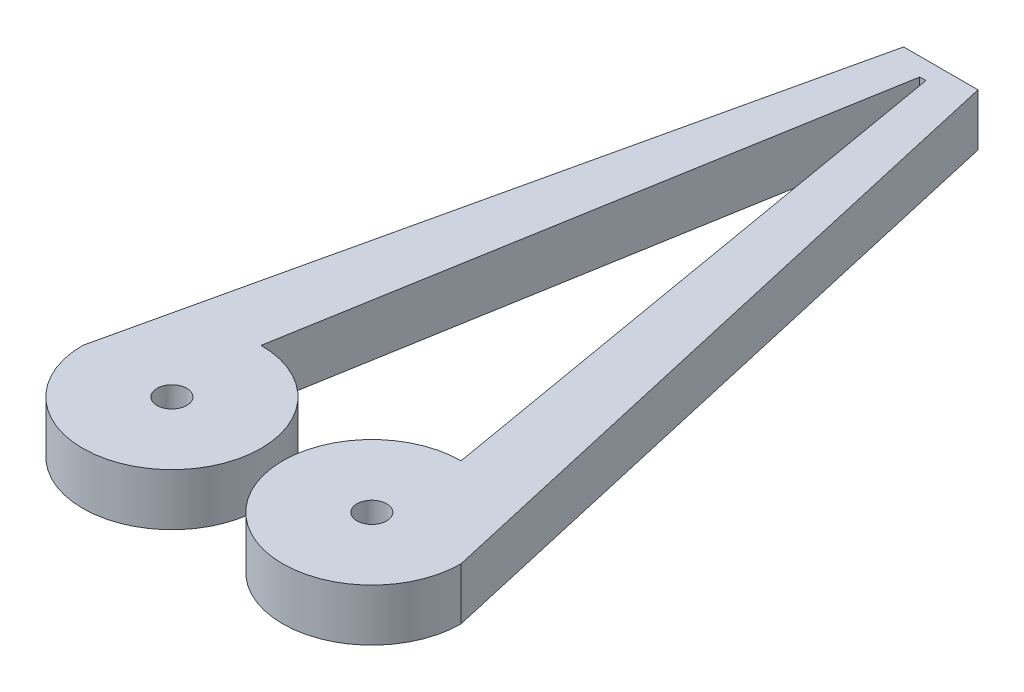
ISO-10303-21;
HEADER;
FILE_DESCRIPTION(('STEP AP214'),'2;1');
FILE_NAME('part.step','',(''),(''),'','','');
FILE_SCHEMA(('AUTOMOTIVE_DESIGN { 1 0 10303 214 1 1 1 1 }'));
ENDSEC;
DATA;
#1=APPLICATION_CONTEXT('core data for automotive mechanical design processes');
#2=APPLICATION_PROTOCOL_DEFINITION('international standard','automotive_design',2000,#1);
#3=PRODUCT_CONTEXT('',#1,'mechanical');
#4=PRODUCT('Part','Part','',(#3));
#5=PRODUCT_RELATED_PRODUCT_CATEGORY('part','',(#4));
#6=PRODUCT_DEFINITION_FORMATION('','',#4);
#7=PRODUCT_DEFINITION_CONTEXT('part definition',#1,'design');
#8=PRODUCT_DEFINITION('design','',#6,#7);
#9=PRODUCT_DEFINITION_SHAPE('','',#8);
#10=(LENGTH_UNIT() NAMED_UNIT(*) SI_UNIT(.MILLI.,.METRE.));
#11=(NAMED_UNIT(*) PLANE_ANGLE_UNIT() SI_UNIT($,.RADIAN.));
#12=(NAMED_UNIT(*) SI_UNIT($,.STERADIAN.) SOLID_ANGLE_UNIT());
#13=UNCERTAINTY_MEASURE_WITH_UNIT(LENGTH_MEASURE(1.E-05),#10,'distance_accuracy_value','');
#14=(GEOMETRIC_REPRESENTATION_CONTEXT(3) GLOBAL_UNCERTAINTY_ASSIGNED_CONTEXT((#13)) GLOBAL_UNIT_ASSIGNED_CONTEXT((#10,
#11,#12)) REPRESENTATION_CONTEXT('',''));
#15=CARTESIAN_POINT('',(0.,0.,0.));
#16=DIRECTION('',(0.,0.,1.));
#17=DIRECTION('',(1.,0.,0.));
#18=AXIS2_PLACEMENT_3D('',#15,#16,#17);
#19=CARTESIAN_POINT('',(26.9,7.,0.));
#20=DIRECTION('',(0.,-1.,0.));
#21=DIRECTION('',(0.,0.,-1.));
#22=AXIS2_PLACEMENT_3D('',#19,#20,#21);
#23=CYLINDRICAL_SURFACE('',#22,12.);
#24=CARTESIAN_POINT('',(26.9,0.,0.));
#25=DIRECTION('',(0.,1.,0.));
#26=DIRECTION('',(0.,0.,1.));
#27=AXIS2_PLACEMENT_3D('',#24,#25,#26);
#28=CIRCLE('',#27,12.);
#29=CARTESIAN_POINT('',(26.9,0.,-12.));
#30=VERTEX_POINT('',#29);
#31=CARTESIAN_POINT('',(38.9,0.,0.));
#32=VERTEX_POINT('',#31);
#33=EDGE_CURVE('E156',#30,#32,#28,.T.);
#34=ORIENTED_EDGE('',*,*,#33,.T.);
#35=DIRECTION('',(0.,-1.,0.));
#36=VECTOR('',#35,1.);
#37=CARTESIAN_POINT('',(38.9,7.,0.));
#38=LINE('',#37,#36);
#39=CARTESIAN_POINT('',(38.9,7.,0.));
#40=VERTEX_POINT('',#39);
#41=EDGE_CURVE('E11',#40,#32,#38,.T.);
#42=ORIENTED_EDGE('',*,*,#41,.F.);
#43=CARTESIAN_POINT('',(26.9,7.,0.));
#44=DIRECTION('',(0.,1.,0.));
#45=DIRECTION('',(0.,0.,1.));
#46=AXIS2_PLACEMENT_3D('',#43,#44,#45);
#47=CIRCLE('',#46,12.);
#48=CARTESIAN_POINT('',(26.9,7.,-12.));
#49=VERTEX_POINT('',#48);
#50=EDGE_CURVE('E100',#49,#40,#47,.T.);
#51=ORIENTED_EDGE('',*,*,#50,.F.);
#52=DIRECTION('',(0.,-1.,0.));
#53=VECTOR('',#52,1.);
#54=CARTESIAN_POINT('',(26.9,7.,-12.));
#55=LINE('',#54,#53);
#56=EDGE_CURVE('E147',#49,#30,#55,.T.);
#57=ORIENTED_EDGE('',*,*,#56,.T.);
#58=EDGE_LOOP('',(#34,#42,#51,#57));
#59=FACE_BOUND('',#58,.T.);
#60=ADVANCED_FACE('F43',(#59),#23,.T.);
#61=CARTESIAN_POINT('',(36.9901983429016,7.,-8.40499506791486));
#62=DIRECTION('',(0.975143498014438,0.,-0.221574272604392));
#63=DIRECTION('',(-0.221574272604392,0.,-0.975143498014438));
#64=AXIS2_PLACEMENT_3D('',#61,#62,#63);
#65=PLANE('',#64);
#66=DIRECTION('',(0.221574272604392,0.,0.975143498014438));
#67=VECTOR('',#66,1.);
#68=CARTESIAN_POINT('',(36.9901983429016,0.,-8.40499506791486));
#69=LINE('',#68,#67);
#70=CARTESIAN_POINT('',(18.45,0.,-90.));
#71=VERTEX_POINT('',#70);
#72=EDGE_CURVE('E160',#71,#32,#69,.T.);
#73=ORIENTED_EDGE('',*,*,#72,.F.);
#74=DIRECTION('',(0.,-1.,0.));
#75=VECTOR('',#74,1.);
#76=CARTESIAN_POINT('',(18.45,7.,-90.));
#77=LINE('',#76,#75);
#78=CARTESIAN_POINT('',(18.45,7.,-90.));
#79=VERTEX_POINT('',#78);
#80=EDGE_CURVE('E53',#79,#71,#77,.T.);
#81=ORIENTED_EDGE('',*,*,#80,.F.);
#82=DIRECTION('',(0.221574272604392,0.,0.975143498014438));
#83=VECTOR('',#82,1.);
#84=CARTESIAN_POINT('',(36.9901983429016,7.,-8.40499506791486));
#85=LINE('',#84,#83);
#86=EDGE_CURVE('E349',#79,#40,#85,.T.);
#87=ORIENTED_EDGE('',*,*,#86,.T.);
#88=ORIENTED_EDGE('',*,*,#41,.T.);
#89=EDGE_LOOP('',(#73,#81,#87,#88));
#90=FACE_BOUND('',#89,.T.);
#91=ADVANCED_FACE('F205',(#90),#65,.T.);
#92=CARTESIAN_POINT('',(0.,7.,-90.));
#93=DIRECTION('',(0.,0.,-1.));
#94=DIRECTION('',(-1.,0.,0.));
#95=AXIS2_PLACEMENT_3D('',#92,#93,#94);
#96=PLANE('',#95);
#97=DIRECTION('',(1.,0.,0.));
#98=VECTOR('',#97,1.);
#99=CARTESIAN_POINT('',(0.,0.,-90.));
#100=LINE('',#99,#98);
#101=CARTESIAN_POINT('',(8.45,0.,-90.));
#102=VERTEX_POINT('',#101);
#103=EDGE_CURVE('E164',#102,#71,#100,.T.);
#104=ORIENTED_EDGE('',*,*,#103,.F.);
#105=DIRECTION('',(0.,-1.,0.));
#106=VECTOR('',#105,1.);
#107=CARTESIAN_POINT('',(8.45,7.,-90.));
#108=LINE('',#107,#106);
#109=CARTESIAN_POINT('',(8.45,7.,-90.));
#110=VERTEX_POINT('',#109);
#111=EDGE_CURVE('E192',#110,#102,#108,.T.);
#112=ORIENTED_EDGE('',*,*,#111,.F.);
#113=DIRECTION('',(1.,0.,0.));
#114=VECTOR('',#113,1.);
#115=CARTESIAN_POINT('',(0.,7.,-90.));
#116=LINE('',#115,#114);
#117=EDGE_CURVE('E202',#110,#79,#116,.T.);
#118=ORIENTED_EDGE('',*,*,#117,.T.);
#119=ORIENTED_EDGE('',*,*,#80,.T.);
#120=EDGE_LOOP('',(#104,#112,#118,#119));
#121=FACE_BOUND('',#120,.T.);
#122=ADVANCED_FACE('F200',(#121),#96,.T.);
#123=CARTESIAN_POINT('',(-11.410858100638,7.,-2.59280053508942));
#124=DIRECTION('',(0.975143498014438,0.,0.221574272604392));
#125=DIRECTION('',(0.221574272604392,0.,-0.975143498014438));
#126=AXIS2_PLACEMENT_3D('',#123,#124,#125);
#127=PLANE('',#126);
#128=DIRECTION('',(-0.221574272604392,0.,0.975143498014438));
#129=VECTOR('',#128,1.);
#130=CARTESIAN_POINT('',(-11.410858100638,0.,-2.59280053508942));
#131=LINE('',#130,#129);
#132=CARTESIAN_POINT('',(-12.,0.,0.));
#133=VERTEX_POINT('',#132);
#134=EDGE_CURVE('E168',#102,#133,#131,.T.);
#135=ORIENTED_EDGE('',*,*,#134,.T.);
#136=DIRECTION('',(0.,-1.,0.));
#137=VECTOR('',#136,1.);
#138=CARTESIAN_POINT('',(-12.,7.,0.));
#139=LINE('',#138,#137);
#140=CARTESIAN_POINT('',(-12.,7.,0.));
#141=VERTEX_POINT('',#140);
#142=EDGE_CURVE('E188',#141,#133,#139,.T.);
#143=ORIENTED_EDGE('',*,*,#142,.F.);
#144=DIRECTION('',(-0.221574272604392,0.,0.975143498014438));
#145=VECTOR('',#144,1.);
#146=CARTESIAN_POINT('',(-11.410858100638,7.,-2.59280053508942));
#147=LINE('',#146,#145);
#148=EDGE_CURVE('E141',#110,#141,#147,.T.);
#149=ORIENTED_EDGE('',*,*,#148,.F.);
#150=ORIENTED_EDGE('',*,*,#111,.T.);
#151=EDGE_LOOP('',(#135,#143,#149,#150));
#152=FACE_BOUND('',#151,.T.);
#153=ADVANCED_FACE('F213',(#152),#127,.F.);
#154=CARTESIAN_POINT('',(0.,7.,0.));
#155=DIRECTION('',(0.,-1.,0.));
#156=DIRECTION('',(0.,0.,-1.));
#157=AXIS2_PLACEMENT_3D('',#154,#155,#156);
#158=CYLINDRICAL_SURFACE('',#157,12.);
#159=CARTESIAN_POINT('',(0.,0.,0.));
#160=DIRECTION('',(0.,1.,0.));
#161=DIRECTION('',(0.,0.,1.));
#162=AXIS2_PLACEMENT_3D('',#159,#160,#161);
#163=CIRCLE('',#162,12.);
#164=CARTESIAN_POINT('',(0.,0.,-12.));
#165=VERTEX_POINT('',#164);
#166=EDGE_CURVE('E171',#133,#165,#163,.T.);
#167=ORIENTED_EDGE('',*,*,#166,.T.);
#168=DIRECTION('',(0.,-1.,0.));
#169=VECTOR('',#168,1.);
#170=CARTESIAN_POINT('',(0.,7.,-12.));
#171=LINE('',#170,#169);
#172=CARTESIAN_POINT('',(0.,7.,-12.));
#173=VERTEX_POINT('',#172);
#174=EDGE_CURVE('E125',#173,#165,#171,.T.);
#175=ORIENTED_EDGE('',*,*,#174,.F.);
#176=CARTESIAN_POINT('',(0.,7.,0.));
#177=DIRECTION('',(0.,1.,0.));
#178=DIRECTION('',(0.,0.,1.));
#179=AXIS2_PLACEMENT_3D('',#176,#177,#178);
#180=CIRCLE('',#179,12.);
#181=EDGE_CURVE('E134',#141,#173,#180,.T.);
#182=ORIENTED_EDGE('',*,*,#181,.F.);
#183=ORIENTED_EDGE('',*,*,#142,.T.);
#184=EDGE_LOOP('',(#167,#175,#182,#183));
#185=FACE_BOUND('',#184,.T.);
#186=ADVANCED_FACE('F216',(#185),#158,.T.);
#187=CARTESIAN_POINT('',(-2.00948059447054,7.,-0.346506589687549));
#188=DIRECTION('',(0.985456468272126,0.,0.169928070490514));
#189=DIRECTION('',(0.169928070490514,0.,-0.985456468272126));
#190=AXIS2_PLACEMENT_3D('',#187,#188,#189);
#191=PLANE('',#190);
#192=DIRECTION('',(-0.169928070490514,0.,0.985456468272126));
#193=VECTOR('',#192,1.);
#194=CARTESIAN_POINT('',(-2.00948059447054,0.,-0.346506589687549));
#195=LINE('',#194,#193);
#196=CARTESIAN_POINT('',(13.0326300632695,0.,-87.5795646791836));
#197=VERTEX_POINT('',#196);
#198=EDGE_CURVE('E123',#197,#165,#195,.T.);
#199=ORIENTED_EDGE('',*,*,#198,.F.);
#200=DIRECTION('',(0.,-1.,0.));
#201=VECTOR('',#200,1.);
#202=CARTESIAN_POINT('',(13.0326300632695,7.,-87.5795646791836));
#203=LINE('',#202,#201);
#204=CARTESIAN_POINT('',(13.0326300632695,7.,-87.5795646791836));
#205=VERTEX_POINT('',#204);
#206=EDGE_CURVE('E117',#205,#197,#203,.T.);
#207=ORIENTED_EDGE('',*,*,#206,.F.);
#208=DIRECTION('',(-0.169928070490514,0.,0.985456468272126));
#209=VECTOR('',#208,1.);
#210=CARTESIAN_POINT('',(-2.00948059447054,7.,-0.346506589687549));
#211=LINE('',#210,#209);
#212=EDGE_CURVE('E121',#205,#173,#211,.T.);
#213=ORIENTED_EDGE('',*,*,#212,.T.);
#214=ORIENTED_EDGE('',*,*,#174,.T.);
#215=EDGE_LOOP('',(#199,#207,#213,#214));
#216=FACE_BOUND('',#215,.T.);
#217=ADVANCED_FACE('F119',(#216),#191,.T.);
#218=CARTESIAN_POINT('',(0.,7.,-87.5795646791836));
#219=DIRECTION('',(0.,0.,-1.));
#220=DIRECTION('',(-1.,0.,0.));
#221=AXIS2_PLACEMENT_3D('',#218,#219,#220);
#222=PLANE('',#221);
#223=DIRECTION('',(1.,0.,0.));
#224=VECTOR('',#223,1.);
#225=CARTESIAN_POINT('',(0.,0.,-87.5795646791836));
#226=LINE('',#225,#224);
#227=CARTESIAN_POINT('',(13.8673699367305,0.,-87.5795646791836));
#228=VERTEX_POINT('',#227);
#229=EDGE_CURVE('E88',#197,#228,#226,.T.);
#230=ORIENTED_EDGE('',*,*,#229,.T.);
#231=DIRECTION('',(0.,-1.,0.));
#232=VECTOR('',#231,1.);
#233=CARTESIAN_POINT('',(13.8673699367305,7.,-87.5795646791836));
#234=LINE('',#233,#232);
#235=CARTESIAN_POINT('',(13.8673699367305,7.,-87.5795646791836));
#236=VERTEX_POINT('',#235);
#237=EDGE_CURVE('E126',#236,#228,#234,.T.);
#238=ORIENTED_EDGE('',*,*,#237,.F.);
#239=DIRECTION('',(1.,0.,0.));
#240=VECTOR('',#239,1.);
#241=CARTESIAN_POINT('',(0.,7.,-87.5795646791836));
#242=LINE('',#241,#240);
#243=EDGE_CURVE('E128',#205,#236,#242,.T.);
#244=ORIENTED_EDGE('',*,*,#243,.F.);
#245=ORIENTED_EDGE('',*,*,#206,.T.);
#246=EDGE_LOOP('',(#230,#238,#244,#245));
#247=FACE_BOUND('',#246,.T.);
#248=ADVANCED_FACE('F129',(#247),#222,.F.);
#249=CARTESIAN_POINT('',(26.9,7.,0.));
#250=DIRECTION('',(0.,-1.,0.));
#251=DIRECTION('',(0.,0.,-1.));
#252=AXIS2_PLACEMENT_3D('',#249,#250,#251);
#253=CYLINDRICAL_SURFACE('',#252,2.);
#254=CARTESIAN_POINT('',(26.9,7.,0.));
#255=DIRECTION('',(0.,1.,0.));
#256=DIRECTION('',(0.,0.,1.));
#257=AXIS2_PLACEMENT_3D('',#254,#255,#256);
#258=CIRCLE('',#257,2.);
#259=CARTESIAN_POINT('',(26.9,7.,2.));
#260=VERTEX_POINT('',#259);
#261=EDGE_CURVE('E246',#260,#260,#258,.T.);
#262=ORIENTED_EDGE('',*,*,#261,.T.);
#263=EDGE_LOOP('',(#262));
#264=FACE_BOUND('',#263,.T.);
#265=CARTESIAN_POINT('',(26.9,0.,0.));
#266=DIRECTION('',(0.,1.,0.));
#267=DIRECTION('',(0.,0.,1.));
#268=AXIS2_PLACEMENT_3D('',#265,#266,#267);
#269=CIRCLE('',#268,2.);
#270=CARTESIAN_POINT('',(26.9,0.,2.));
#271=VERTEX_POINT('',#270);
#272=EDGE_CURVE('E152',#271,#271,#269,.T.);
#273=ORIENTED_EDGE('',*,*,#272,.F.);
#274=EDGE_LOOP('',(#273));
#275=FACE_BOUND('',#274,.T.);
#276=ADVANCED_FACE('F227',(#264,#275),#253,.F.);
#277=CARTESIAN_POINT('',(0.,7.,0.));
#278=DIRECTION('',(0.,-1.,0.));
#279=DIRECTION('',(0.,0.,-1.));
#280=AXIS2_PLACEMENT_3D('',#277,#278,#279);
#281=CYLINDRICAL_SURFACE('',#280,2.);
#282=CARTESIAN_POINT('',(0.,7.,0.));
#283=DIRECTION('',(0.,1.,0.));
#284=DIRECTION('',(0.,0.,1.));
#285=AXIS2_PLACEMENT_3D('',#282,#283,#284);
#286=CIRCLE('',#285,2.);
#287=CARTESIAN_POINT('',(0.,7.,2.));
#288=VERTEX_POINT('',#287);
#289=EDGE_CURVE('E181',#288,#288,#286,.T.);
#290=ORIENTED_EDGE('',*,*,#289,.T.);
#291=EDGE_LOOP('',(#290));
#292=FACE_BOUND('',#291,.T.);
#293=CARTESIAN_POINT('',(0.,0.,0.));
#294=DIRECTION('',(0.,1.,0.));
#295=DIRECTION('',(0.,0.,1.));
#296=AXIS2_PLACEMENT_3D('',#293,#294,#295);
#297=CIRCLE('',#296,2.);
#298=CARTESIAN_POINT('',(0.,0.,2.));
#299=VERTEX_POINT('',#298);
#300=EDGE_CURVE('E148',#299,#299,#297,.T.);
#301=ORIENTED_EDGE('',*,*,#300,.F.);
#302=EDGE_LOOP('',(#301));
#303=FACE_BOUND('',#302,.T.);
#304=ADVANCED_FACE('F45',(#292,#303),#281,.F.);
#305=CARTESIAN_POINT('',(28.1327283225876,7.,-4.85109225562569));
#306=DIRECTION('',(0.985456468272126,0.,-0.169928070490514));
#307=DIRECTION('',(-0.169928070490514,0.,-0.985456468272126));
#308=AXIS2_PLACEMENT_3D('',#305,#306,#307);
#309=PLANE('',#308);
#310=DIRECTION('',(0.169928070490514,0.,0.985456468272126));
#311=VECTOR('',#310,1.);
#312=CARTESIAN_POINT('',(28.1327283225876,0.,-4.85109225562569));
#313=LINE('',#312,#311);
#314=EDGE_CURVE('E94',#228,#30,#313,.T.);
#315=ORIENTED_EDGE('',*,*,#314,.T.);
#316=ORIENTED_EDGE('',*,*,#56,.F.);
#317=DIRECTION('',(0.169928070490514,0.,0.985456468272126));
#318=VECTOR('',#317,1.);
#319=CARTESIAN_POINT('',(28.1327283225876,7.,-4.85109225562569));
#320=LINE('',#319,#318);
#321=EDGE_CURVE('E61',#236,#49,#320,.T.);
#322=ORIENTED_EDGE('',*,*,#321,.F.);
#323=ORIENTED_EDGE('',*,*,#237,.T.);
#324=EDGE_LOOP('',(#315,#316,#322,#323));
#325=FACE_BOUND('',#324,.T.);
#326=ADVANCED_FACE('F218',(#325),#309,.F.);
#327=CARTESIAN_POINT('',(0.,7.,0.));
#328=DIRECTION('',(0.,1.,0.));
#329=DIRECTION('',(0.,0.,1.));
#330=AXIS2_PLACEMENT_3D('',#327,#328,#329);
#331=PLANE('',#330);
#332=ORIENTED_EDGE('',*,*,#289,.F.);
#333=EDGE_LOOP('',(#332));
#334=FACE_BOUND('',#333,.T.);
#335=ORIENTED_EDGE('',*,*,#261,.F.);
#336=EDGE_LOOP('',(#335));
#337=FACE_BOUND('',#336,.T.);
#338=ORIENTED_EDGE('',*,*,#50,.T.);
#339=ORIENTED_EDGE('',*,*,#86,.F.);
#340=ORIENTED_EDGE('',*,*,#117,.F.);
#341=ORIENTED_EDGE('',*,*,#148,.T.);
#342=ORIENTED_EDGE('',*,*,#181,.T.);
#343=ORIENTED_EDGE('',*,*,#212,.F.);
#344=ORIENTED_EDGE('',*,*,#243,.T.);
#345=ORIENTED_EDGE('',*,*,#321,.T.);
#346=EDGE_LOOP('',(#338,#339,#340,#341,#342,#343,#344,#345));
#347=FACE_BOUND('',#346,.T.);
#348=ADVANCED_FACE('F132',(#334,#337,#347),#331,.T.);
#349=CARTESIAN_POINT('',(0.,0.,0.));
#350=DIRECTION('',(0.,1.,0.));
#351=DIRECTION('',(0.,0.,1.));
#352=AXIS2_PLACEMENT_3D('',#349,#350,#351);
#353=PLANE('',#352);
#354=ORIENTED_EDGE('',*,*,#300,.T.);
#355=EDGE_LOOP('',(#354));
#356=FACE_BOUND('',#355,.T.);
#357=ORIENTED_EDGE('',*,*,#272,.T.);
#358=EDGE_LOOP('',(#357));
#359=FACE_BOUND('',#358,.T.);
#360=ORIENTED_EDGE('',*,*,#33,.F.);
#361=ORIENTED_EDGE('',*,*,#314,.F.);
#362=ORIENTED_EDGE('',*,*,#229,.F.);
#363=ORIENTED_EDGE('',*,*,#198,.T.);
#364=ORIENTED_EDGE('',*,*,#166,.F.);
#365=ORIENTED_EDGE('',*,*,#134,.F.);
#366=ORIENTED_EDGE('',*,*,#103,.T.);
#367=ORIENTED_EDGE('',*,*,#72,.T.);
#368=EDGE_LOOP('',(#360,#361,#362,#363,#364,#365,#366,#367));
#369=FACE_BOUND('',#368,.T.);
#370=ADVANCED_FACE('F209',(#356,#359,#369),#353,.F.);
#371=CLOSED_SHELL('',(#60,#91,#122,#153,#186,#217,#248,#276,#304,#326,#348,#370));
#372=MANIFOLD_SOLID_BREP('B2',#371);
#373=ADVANCED_BREP_SHAPE_REPRESENTATION('',(#18,#372),#14);
#374=SHAPE_DEFINITION_REPRESENTATION(#9,#373);
ENDSEC;
END-ISO-10303-21;
